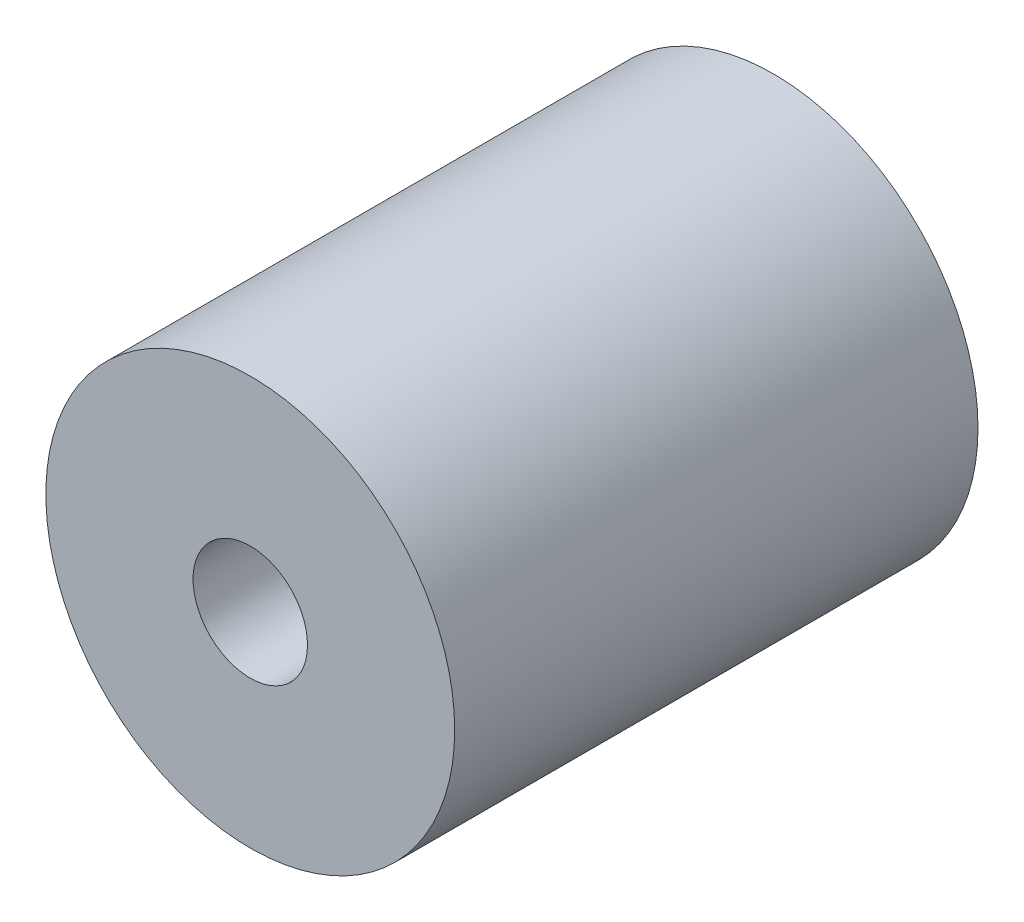
ISO-10303-21;
HEADER;
FILE_DESCRIPTION(('STEP AP214'),'2;1');
FILE_NAME('part.step','',(''),(''),'','','');
FILE_SCHEMA(('AUTOMOTIVE_DESIGN { 1 0 10303 214 1 1 1 1 }'));
ENDSEC;
DATA;
#1=APPLICATION_CONTEXT('core data for automotive mechanical design processes');
#2=APPLICATION_PROTOCOL_DEFINITION('international standard','automotive_design',2000,#1);
#3=PRODUCT_CONTEXT('',#1,'mechanical');
#4=PRODUCT('Part','Part','',(#3));
#5=PRODUCT_RELATED_PRODUCT_CATEGORY('part','',(#4));
#6=PRODUCT_DEFINITION_FORMATION('','',#4);
#7=PRODUCT_DEFINITION_CONTEXT('part definition',#1,'design');
#8=PRODUCT_DEFINITION('design','',#6,#7);
#9=PRODUCT_DEFINITION_SHAPE('','',#8);
#10=(LENGTH_UNIT() NAMED_UNIT(*) SI_UNIT(.MILLI.,.METRE.));
#11=(NAMED_UNIT(*) PLANE_ANGLE_UNIT() SI_UNIT($,.RADIAN.));
#12=(NAMED_UNIT(*) SI_UNIT($,.STERADIAN.) SOLID_ANGLE_UNIT());
#13=UNCERTAINTY_MEASURE_WITH_UNIT(LENGTH_MEASURE(1.E-05),#10,'distance_accuracy_value','');
#14=(GEOMETRIC_REPRESENTATION_CONTEXT(3) GLOBAL_UNCERTAINTY_ASSIGNED_CONTEXT((#13)) GLOBAL_UNIT_ASSIGNED_CONTEXT((#10,
#11,#12)) REPRESENTATION_CONTEXT('',''));
#15=CARTESIAN_POINT('',(0.,0.,0.));
#16=DIRECTION('',(0.,0.,1.));
#17=DIRECTION('',(1.,0.,0.));
#18=AXIS2_PLACEMENT_3D('',#15,#16,#17);
#19=CARTESIAN_POINT('',(0.,0.,16.));
#20=DIRECTION('',(0.,0.,1.));
#21=DIRECTION('',(1.,0.,0.));
#22=AXIS2_PLACEMENT_3D('',#19,#20,#21);
#23=PLANE('',#22);
#24=CARTESIAN_POINT('',(0.,0.,16.));
#25=DIRECTION('',(0.,0.,1.));
#26=DIRECTION('',(1.,0.,0.));
#27=AXIS2_PLACEMENT_3D('',#24,#25,#26);
#28=CIRCLE('',#27,12.5);
#29=CARTESIAN_POINT('',(12.5,0.,16.));
#30=VERTEX_POINT('',#29);
#31=EDGE_CURVE('E10',#30,#30,#28,.T.);
#32=ORIENTED_EDGE('',*,*,#31,.T.);
#33=EDGE_LOOP('',(#32));
#34=FACE_BOUND('',#33,.T.);
#35=CARTESIAN_POINT('',(0.,0.,16.));
#36=DIRECTION('',(0.,0.,1.));
#37=DIRECTION('',(1.,0.,0.));
#38=AXIS2_PLACEMENT_3D('',#35,#36,#37);
#39=CIRCLE('',#38,3.5);
#40=CARTESIAN_POINT('',(3.5,0.,16.));
#41=VERTEX_POINT('',#40);
#42=EDGE_CURVE('E44',#41,#41,#39,.T.);
#43=ORIENTED_EDGE('',*,*,#42,.F.);
#44=EDGE_LOOP('',(#43));
#45=FACE_BOUND('',#44,.T.);
#46=ADVANCED_FACE('F33',(#34,#45),#23,.T.);
#47=CARTESIAN_POINT('',(0.,0.,-16.));
#48=DIRECTION('',(0.,0.,1.));
#49=DIRECTION('',(1.,0.,0.));
#50=AXIS2_PLACEMENT_3D('',#47,#48,#49);
#51=PLANE('',#50);
#52=CARTESIAN_POINT('',(0.,0.,-16.));
#53=DIRECTION('',(0.,0.,1.));
#54=DIRECTION('',(1.,0.,0.));
#55=AXIS2_PLACEMENT_3D('',#52,#53,#54);
#56=CIRCLE('',#55,12.5);
#57=CARTESIAN_POINT('',(12.5,0.,-16.));
#58=VERTEX_POINT('',#57);
#59=EDGE_CURVE('E37',#58,#58,#56,.T.);
#60=ORIENTED_EDGE('',*,*,#59,.F.);
#61=EDGE_LOOP('',(#60));
#62=FACE_BOUND('',#61,.T.);
#63=CARTESIAN_POINT('',(0.,0.,-16.));
#64=DIRECTION('',(0.,0.,1.));
#65=DIRECTION('',(1.,0.,0.));
#66=AXIS2_PLACEMENT_3D('',#63,#64,#65);
#67=CIRCLE('',#66,3.5);
#68=CARTESIAN_POINT('',(3.5,0.,-16.));
#69=VERTEX_POINT('',#68);
#70=EDGE_CURVE('E46',#69,#69,#67,.T.);
#71=ORIENTED_EDGE('',*,*,#70,.T.);
#72=EDGE_LOOP('',(#71));
#73=FACE_BOUND('',#72,.T.);
#74=ADVANCED_FACE('F56',(#62,#73),#51,.F.);
#75=CARTESIAN_POINT('',(0.,0.,16.));
#76=DIRECTION('',(0.,0.,-1.));
#77=DIRECTION('',(-1.,0.,0.));
#78=AXIS2_PLACEMENT_3D('',#75,#76,#77);
#79=CYLINDRICAL_SURFACE('',#78,12.5);
#80=ORIENTED_EDGE('',*,*,#31,.F.);
#81=EDGE_LOOP('',(#80));
#82=FACE_BOUND('',#81,.T.);
#83=ORIENTED_EDGE('',*,*,#59,.T.);
#84=EDGE_LOOP('',(#83));
#85=FACE_BOUND('',#84,.T.);
#86=ADVANCED_FACE('F35',(#82,#85),#79,.T.);
#87=CARTESIAN_POINT('',(0.,0.,16.));
#88=DIRECTION('',(0.,0.,-1.));
#89=DIRECTION('',(-1.,0.,0.));
#90=AXIS2_PLACEMENT_3D('',#87,#88,#89);
#91=CYLINDRICAL_SURFACE('',#90,3.5);
#92=ORIENTED_EDGE('',*,*,#42,.T.);
#93=EDGE_LOOP('',(#92));
#94=FACE_BOUND('',#93,.T.);
#95=ORIENTED_EDGE('',*,*,#70,.F.);
#96=EDGE_LOOP('',(#95));
#97=FACE_BOUND('',#96,.T.);
#98=ADVANCED_FACE('F52',(#94,#97),#91,.F.);
#99=CLOSED_SHELL('',(#46,#74,#86,#98));
#100=MANIFOLD_SOLID_BREP('B2',#99);
#101=ADVANCED_BREP_SHAPE_REPRESENTATION('',(#18,#100),#14);
#102=SHAPE_DEFINITION_REPRESENTATION(#9,#101);
ENDSEC;
END-ISO-10303-21;
